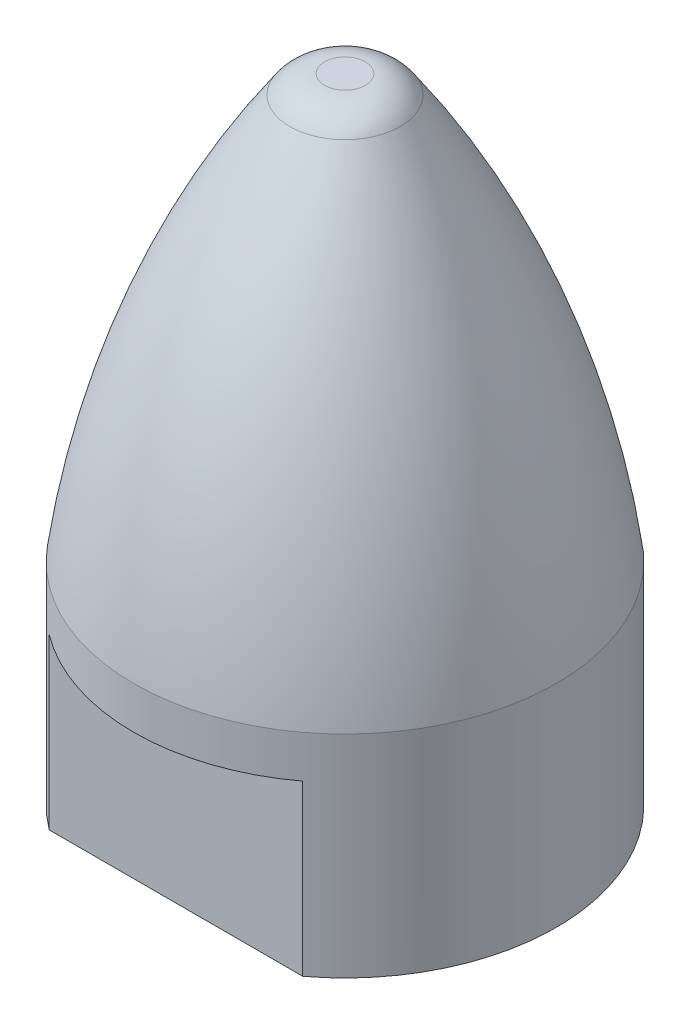
ISO-10303-21;
HEADER;
FILE_DESCRIPTION(('STEP AP214'),'2;1');
FILE_NAME('part.step','',(''),(''),'','','');
FILE_SCHEMA(('AUTOMOTIVE_DESIGN { 1 0 10303 214 1 1 1 1 }'));
ENDSEC;
DATA;
#1=APPLICATION_CONTEXT('core data for automotive mechanical design processes');
#2=APPLICATION_PROTOCOL_DEFINITION('international standard','automotive_design',2000,#1);
#3=PRODUCT_CONTEXT('',#1,'mechanical');
#4=PRODUCT('Part','Part','',(#3));
#5=PRODUCT_RELATED_PRODUCT_CATEGORY('part','',(#4));
#6=PRODUCT_DEFINITION_FORMATION('','',#4);
#7=PRODUCT_DEFINITION_CONTEXT('part definition',#1,'design');
#8=PRODUCT_DEFINITION('design','',#6,#7);
#9=PRODUCT_DEFINITION_SHAPE('','',#8);
#10=(LENGTH_UNIT() NAMED_UNIT(*) SI_UNIT(.MILLI.,.METRE.));
#11=(NAMED_UNIT(*) PLANE_ANGLE_UNIT() SI_UNIT($,.RADIAN.));
#12=(NAMED_UNIT(*) SI_UNIT($,.STERADIAN.) SOLID_ANGLE_UNIT());
#13=UNCERTAINTY_MEASURE_WITH_UNIT(LENGTH_MEASURE(1.E-05),#10,'distance_accuracy_value','');
#14=(GEOMETRIC_REPRESENTATION_CONTEXT(3) GLOBAL_UNCERTAINTY_ASSIGNED_CONTEXT((#13)) GLOBAL_UNIT_ASSIGNED_CONTEXT((#10,
#11,#12)) REPRESENTATION_CONTEXT('',''));
#15=CARTESIAN_POINT('',(0.,0.,0.));
#16=DIRECTION('',(0.,0.,1.));
#17=DIRECTION('',(1.,0.,0.));
#18=AXIS2_PLACEMENT_3D('',#15,#16,#17);
#19=CARTESIAN_POINT('',(0.,15.,0.));
#20=DIRECTION('',(0.,-1.,0.));
#21=DIRECTION('',(0.,0.,-1.));
#22=AXIS2_PLACEMENT_3D('',#19,#20,#21);
#23=PLANE('',#22);
#24=CARTESIAN_POINT('',(0.,15.,0.));
#25=DIRECTION('',(0.,-1.,0.));
#26=DIRECTION('',(0.,0.,-1.));
#27=AXIS2_PLACEMENT_3D('',#24,#25,#26);
#28=CIRCLE('',#27,0.482630849008365);
#29=CARTESIAN_POINT('',(0.,15.,-0.482630849008365));
#30=VERTEX_POINT('',#29);
#31=EDGE_CURVE('E139',#30,#30,#28,.F.);
#32=ORIENTED_EDGE('',*,*,#31,.T.);
#33=EDGE_LOOP('',(#32));
#34=FACE_BOUND('',#33,.T.);
#35=ADVANCED_FACE('F45',(#34),#23,.F.);
#36=CARTESIAN_POINT('',(0.,2.07796612670362,0.));
#37=DIRECTION('',(0.,-1.,0.));
#38=DIRECTION('',(0.,0.,-1.));
#39=AXIS2_PLACEMENT_3D('',#36,#37,#38);
#40=DEGENERATE_TOROIDAL_SURFACE('',#39,16.8050846832409,22.,.F.);
#41=CARTESIAN_POINT('',(0.,14.5677158987284,0.));
#42=DIRECTION('',(0.,-1.,0.));
#43=DIRECTION('',(0.,0.,-1.));
#44=AXIS2_PLACEMENT_3D('',#41,#42,#43);
#45=CIRCLE('',#44,1.30585539816309);
#46=CARTESIAN_POINT('',(0.,14.5677158987284,-1.30585539816309));
#47=VERTEX_POINT('',#46);
#48=EDGE_CURVE('E135',#47,#47,#45,.T.);
#49=ORIENTED_EDGE('',*,*,#48,.T.);
#50=EDGE_LOOP('',(#49));
#51=FACE_BOUND('',#50,.T.);
#52=CARTESIAN_POINT('',(0.,5.,0.));
#53=DIRECTION('',(0.,-1.,0.));
#54=DIRECTION('',(0.,0.,-1.));
#55=AXIS2_PLACEMENT_3D('',#52,#53,#54);
#56=CIRCLE('',#55,5.);
#57=CARTESIAN_POINT('',(0.,5.,-5.));
#58=VERTEX_POINT('',#57);
#59=EDGE_CURVE('E131',#58,#58,#56,.T.);
#60=ORIENTED_EDGE('',*,*,#59,.F.);
#61=EDGE_LOOP('',(#60));
#62=FACE_BOUND('',#61,.T.);
#63=ADVANCED_FACE('F173',(#51,#62),#40,.F.);
#64=CARTESIAN_POINT('',(0.,0.,0.));
#65=DIRECTION('',(0.,-1.,0.));
#66=DIRECTION('',(0.,0.,-1.));
#67=AXIS2_PLACEMENT_3D('',#64,#65,#66);
#68=CYLINDRICAL_SURFACE('',#67,5.);
#69=CARTESIAN_POINT('',(0.,4.,0.));
#70=DIRECTION('',(0.,1.,0.));
#71=DIRECTION('',(0.,0.,1.));
#72=AXIS2_PLACEMENT_3D('',#69,#70,#71);
#73=CIRCLE('',#72,5.);
#74=CARTESIAN_POINT('',(-3.,4.,4.));
#75=VERTEX_POINT('',#74);
#76=CARTESIAN_POINT('',(3.,4.,4.));
#77=VERTEX_POINT('',#76);
#78=EDGE_CURVE('E11',#75,#77,#73,.T.);
#79=ORIENTED_EDGE('',*,*,#78,.T.);
#80=DIRECTION('',(0.,-1.,0.));
#81=VECTOR('',#80,1.);
#82=CARTESIAN_POINT('',(3.,0.,4.));
#83=LINE('',#82,#81);
#84=CARTESIAN_POINT('',(3.,0.,4.));
#85=VERTEX_POINT('',#84);
#86=EDGE_CURVE('E122',#77,#85,#83,.T.);
#87=ORIENTED_EDGE('',*,*,#86,.T.);
#88=CARTESIAN_POINT('',(0.,0.,0.));
#89=DIRECTION('',(0.,-1.,0.));
#90=DIRECTION('',(0.,0.,-1.));
#91=AXIS2_PLACEMENT_3D('',#88,#89,#90);
#92=CIRCLE('',#91,5.);
#93=CARTESIAN_POINT('',(3.,0.,-4.));
#94=VERTEX_POINT('',#93);
#95=EDGE_CURVE('E127',#94,#85,#92,.T.);
#96=ORIENTED_EDGE('',*,*,#95,.F.);
#97=DIRECTION('',(0.,-1.,0.));
#98=VECTOR('',#97,1.);
#99=CARTESIAN_POINT('',(3.,0.,-4.));
#100=LINE('',#99,#98);
#101=CARTESIAN_POINT('',(3.,4.,-4.));
#102=VERTEX_POINT('',#101);
#103=EDGE_CURVE('E69',#94,#102,#100,.F.);
#104=ORIENTED_EDGE('',*,*,#103,.T.);
#105=CARTESIAN_POINT('',(0.,4.,0.));
#106=DIRECTION('',(0.,1.,0.));
#107=DIRECTION('',(0.,0.,1.));
#108=AXIS2_PLACEMENT_3D('',#105,#106,#107);
#109=CIRCLE('',#108,5.);
#110=CARTESIAN_POINT('',(-3.,4.,-4.));
#111=VERTEX_POINT('',#110);
#112=EDGE_CURVE('E54',#102,#111,#109,.T.);
#113=ORIENTED_EDGE('',*,*,#112,.T.);
#114=DIRECTION('',(0.,-1.,0.));
#115=VECTOR('',#114,1.);
#116=CARTESIAN_POINT('',(-3.,0.,-4.));
#117=LINE('',#116,#115);
#118=CARTESIAN_POINT('',(-3.,0.,-4.));
#119=VERTEX_POINT('',#118);
#120=EDGE_CURVE('E116',#111,#119,#117,.T.);
#121=ORIENTED_EDGE('',*,*,#120,.T.);
#122=CARTESIAN_POINT('',(-3.,0.,4.));
#123=VERTEX_POINT('',#122);
#124=EDGE_CURVE('E126',#123,#119,#92,.T.);
#125=ORIENTED_EDGE('',*,*,#124,.F.);
#126=DIRECTION('',(0.,-1.,0.));
#127=VECTOR('',#126,1.);
#128=CARTESIAN_POINT('',(-3.,0.,4.));
#129=LINE('',#128,#127);
#130=EDGE_CURVE('E61',#123,#75,#129,.F.);
#131=ORIENTED_EDGE('',*,*,#130,.T.);
#132=EDGE_LOOP('',(#79,#87,#96,#104,#113,#121,#125,#131));
#133=FACE_BOUND('',#132,.T.);
#134=ORIENTED_EDGE('',*,*,#59,.T.);
#135=EDGE_LOOP('',(#134));
#136=FACE_BOUND('',#135,.T.);
#137=ADVANCED_FACE('F151',(#133,#136),#68,.T.);
#138=CARTESIAN_POINT('',(0.,0.,0.));
#139=DIRECTION('',(0.,1.,0.));
#140=DIRECTION('',(0.,0.,1.));
#141=AXIS2_PLACEMENT_3D('',#138,#139,#140);
#142=PLANE('',#141);
#143=CARTESIAN_POINT('',(0.,0.,0.));
#144=DIRECTION('',(0.,-1.,0.));
#145=DIRECTION('',(0.,0.,-1.));
#146=AXIS2_PLACEMENT_3D('',#143,#144,#145);
#147=CIRCLE('',#146,2.09999999999999);
#148=CARTESIAN_POINT('',(0.,0.,-2.09999999999999));
#149=VERTEX_POINT('',#148);
#150=EDGE_CURVE('E102',#149,#149,#147,.T.);
#151=ORIENTED_EDGE('',*,*,#150,.F.);
#152=EDGE_LOOP('',(#151));
#153=FACE_BOUND('',#152,.T.);
#154=ORIENTED_EDGE('',*,*,#95,.T.);
#155=DIRECTION('',(-1.,0.,0.));
#156=VECTOR('',#155,1.);
#157=CARTESIAN_POINT('',(0.,0.,4.));
#158=LINE('',#157,#156);
#159=EDGE_CURVE('E146',#85,#123,#158,.T.);
#160=ORIENTED_EDGE('',*,*,#159,.T.);
#161=ORIENTED_EDGE('',*,*,#124,.T.);
#162=DIRECTION('',(1.,0.,0.));
#163=VECTOR('',#162,1.);
#164=CARTESIAN_POINT('',(0.,0.,-4.));
#165=LINE('',#164,#163);
#166=EDGE_CURVE('E143',#119,#94,#165,.T.);
#167=ORIENTED_EDGE('',*,*,#166,.T.);
#168=EDGE_LOOP('',(#154,#160,#161,#167));
#169=FACE_BOUND('',#168,.T.);
#170=ADVANCED_FACE('F161',(#153,#169),#142,.F.);
#171=CARTESIAN_POINT('',(0.,14.,0.));
#172=DIRECTION('',(0.,-1.,0.));
#173=DIRECTION('',(0.,0.,-1.));
#174=AXIS2_PLACEMENT_3D('',#171,#172,#173);
#175=DEGENERATE_TOROIDAL_SURFACE('',#174,0.482630849008365,1.,.T.);
#176=ORIENTED_EDGE('',*,*,#31,.F.);
#177=EDGE_LOOP('',(#176));
#178=FACE_BOUND('',#177,.T.);
#179=ORIENTED_EDGE('',*,*,#48,.F.);
#180=EDGE_LOOP('',(#179));
#181=FACE_BOUND('',#180,.T.);
#182=ADVANCED_FACE('F47',(#178,#181),#175,.T.);
#183=CARTESIAN_POINT('',(-5.,4.,-4.));
#184=DIRECTION('',(0.,1.,0.));
#185=DIRECTION('',(0.,0.,1.));
#186=AXIS2_PLACEMENT_3D('',#183,#184,#185);
#187=PLANE('',#186);
#188=DIRECTION('',(1.,0.,0.));
#189=VECTOR('',#188,1.);
#190=CARTESIAN_POINT('',(-5.,4.,-4.));
#191=LINE('',#190,#189);
#192=EDGE_CURVE('E101',#111,#102,#191,.T.);
#193=ORIENTED_EDGE('',*,*,#192,.F.);
#194=ORIENTED_EDGE('',*,*,#112,.F.);
#195=EDGE_LOOP('',(#193,#194));
#196=FACE_BOUND('',#195,.T.);
#197=ADVANCED_FACE('F158',(#196),#187,.F.);
#198=CARTESIAN_POINT('',(-5.,0.,-4.));
#199=DIRECTION('',(0.,0.,1.));
#200=DIRECTION('',(1.,0.,0.));
#201=AXIS2_PLACEMENT_3D('',#198,#199,#200);
#202=PLANE('',#201);
#203=ORIENTED_EDGE('',*,*,#192,.T.);
#204=ORIENTED_EDGE('',*,*,#103,.F.);
#205=ORIENTED_EDGE('',*,*,#166,.F.);
#206=ORIENTED_EDGE('',*,*,#120,.F.);
#207=EDGE_LOOP('',(#203,#204,#205,#206));
#208=FACE_BOUND('',#207,.T.);
#209=ADVANCED_FACE('F159',(#208),#202,.F.);
#210=CARTESIAN_POINT('',(-5.,4.,4.));
#211=DIRECTION('',(0.,1.,0.));
#212=DIRECTION('',(0.,0.,1.));
#213=AXIS2_PLACEMENT_3D('',#210,#211,#212);
#214=PLANE('',#213);
#215=DIRECTION('',(1.,0.,0.));
#216=VECTOR('',#215,1.);
#217=CARTESIAN_POINT('',(-5.,4.,4.));
#218=LINE('',#217,#216);
#219=EDGE_CURVE('E106',#75,#77,#218,.T.);
#220=ORIENTED_EDGE('',*,*,#219,.T.);
#221=ORIENTED_EDGE('',*,*,#78,.F.);
#222=EDGE_LOOP('',(#220,#221));
#223=FACE_BOUND('',#222,.T.);
#224=ADVANCED_FACE('F163',(#223),#214,.F.);
#225=CARTESIAN_POINT('',(-5.,0.,4.));
#226=DIRECTION('',(0.,0.,-1.));
#227=DIRECTION('',(-1.,0.,0.));
#228=AXIS2_PLACEMENT_3D('',#225,#226,#227);
#229=PLANE('',#228);
#230=ORIENTED_EDGE('',*,*,#219,.F.);
#231=ORIENTED_EDGE('',*,*,#130,.F.);
#232=ORIENTED_EDGE('',*,*,#159,.F.);
#233=ORIENTED_EDGE('',*,*,#86,.F.);
#234=EDGE_LOOP('',(#230,#231,#232,#233));
#235=FACE_BOUND('',#234,.T.);
#236=ADVANCED_FACE('F94',(#235),#229,.F.);
#237=CARTESIAN_POINT('',(0.,8.,0.));
#238=DIRECTION('',(0.,-1.,0.));
#239=DIRECTION('',(0.,0.,-1.));
#240=AXIS2_PLACEMENT_3D('',#237,#238,#239);
#241=CONICAL_SURFACE('',#240,2.1,1.02974425867665);
#242=CARTESIAN_POINT('',(0.,9.26180729995788,0.));
#243=VERTEX_POINT('',#242);
#244=VERTEX_LOOP('',#243);
#245=FACE_BOUND('',#244,.T.);
#246=CARTESIAN_POINT('',(0.,8.,0.));
#247=DIRECTION('',(0.,-1.,0.));
#248=DIRECTION('',(0.,0.,-1.));
#249=AXIS2_PLACEMENT_3D('',#246,#247,#248);
#250=CIRCLE('',#249,2.1);
#251=CARTESIAN_POINT('',(0.,8.,-2.1));
#252=VERTEX_POINT('',#251);
#253=EDGE_CURVE('E98',#252,#252,#250,.T.);
#254=ORIENTED_EDGE('',*,*,#253,.T.);
#255=EDGE_LOOP('',(#254));
#256=FACE_BOUND('',#255,.T.);
#257=ADVANCED_FACE('F90',(#245,#256),#241,.F.);
#258=CARTESIAN_POINT('',(0.,0.,0.));
#259=DIRECTION('',(0.,-1.,0.));
#260=DIRECTION('',(0.,0.,-1.));
#261=AXIS2_PLACEMENT_3D('',#258,#259,#260);
#262=CYLINDRICAL_SURFACE('',#261,2.09999999999999);
#263=ORIENTED_EDGE('',*,*,#253,.F.);
#264=EDGE_LOOP('',(#263));
#265=FACE_BOUND('',#264,.T.);
#266=ORIENTED_EDGE('',*,*,#150,.T.);
#267=EDGE_LOOP('',(#266));
#268=FACE_BOUND('',#267,.T.);
#269=ADVANCED_FACE('F93',(#265,#268),#262,.F.);
#270=CLOSED_SHELL('',(#35,#63,#137,#170,#182,#197,#209,#224,#236,#257,#269));
#271=MANIFOLD_SOLID_BREP('B2',#270);
#272=ADVANCED_BREP_SHAPE_REPRESENTATION('',(#18,#271),#14);
#273=SHAPE_DEFINITION_REPRESENTATION(#9,#272);
ENDSEC;
END-ISO-10303-21;
